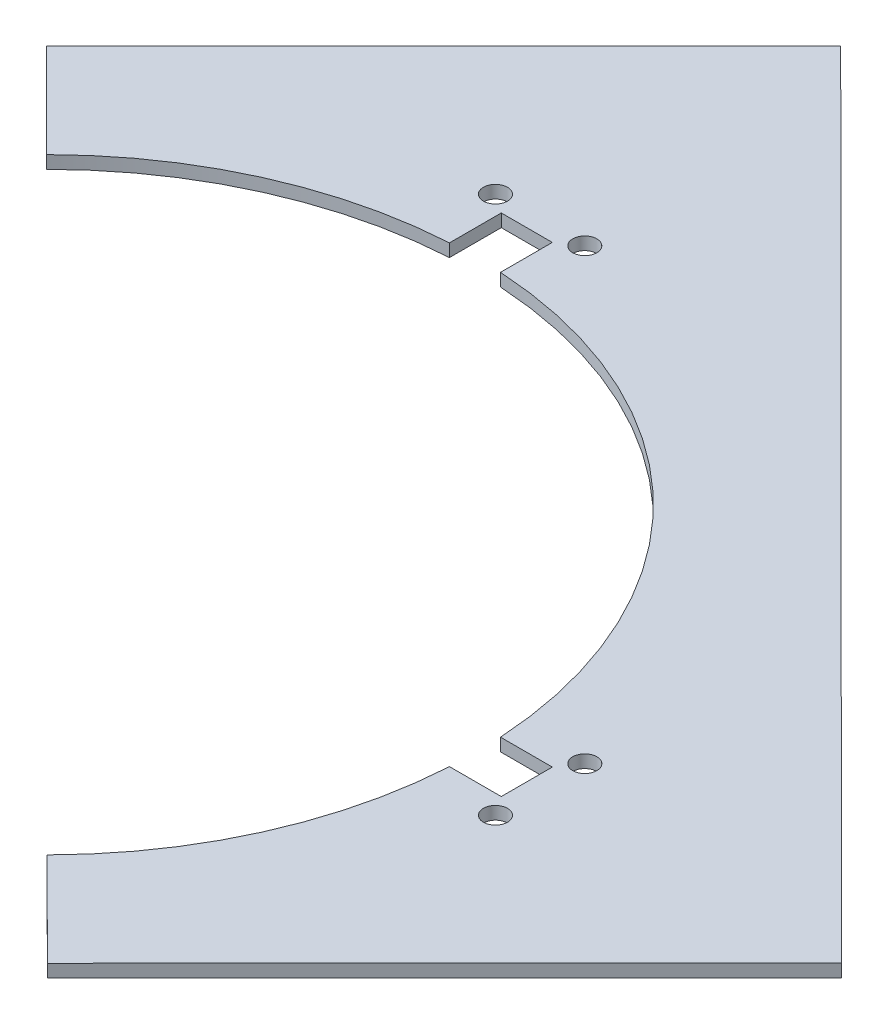
ISO-10303-21;
HEADER;
FILE_DESCRIPTION(('STEP AP214'),'2;1');
FILE_NAME('part.step','',(''),(''),'','','');
FILE_SCHEMA(('AUTOMOTIVE_DESIGN { 1 0 10303 214 1 1 1 1 }'));
ENDSEC;
DATA;
#1=APPLICATION_CONTEXT('core data for automotive mechanical design processes');
#2=APPLICATION_PROTOCOL_DEFINITION('international standard','automotive_design',2000,#1);
#3=PRODUCT_CONTEXT('',#1,'mechanical');
#4=PRODUCT('Part','Part','',(#3));
#5=PRODUCT_RELATED_PRODUCT_CATEGORY('part','',(#4));
#6=PRODUCT_DEFINITION_FORMATION('','',#4);
#7=PRODUCT_DEFINITION_CONTEXT('part definition',#1,'design');
#8=PRODUCT_DEFINITION('design','',#6,#7);
#9=PRODUCT_DEFINITION_SHAPE('','',#8);
#10=(LENGTH_UNIT() NAMED_UNIT(*) SI_UNIT(.MILLI.,.METRE.));
#11=(NAMED_UNIT(*) PLANE_ANGLE_UNIT() SI_UNIT($,.RADIAN.));
#12=(NAMED_UNIT(*) SI_UNIT($,.STERADIAN.) SOLID_ANGLE_UNIT());
#13=UNCERTAINTY_MEASURE_WITH_UNIT(LENGTH_MEASURE(1.E-05),#10,'distance_accuracy_value','');
#14=(GEOMETRIC_REPRESENTATION_CONTEXT(3) GLOBAL_UNCERTAINTY_ASSIGNED_CONTEXT((#13)) GLOBAL_UNIT_ASSIGNED_CONTEXT((#10,
#11,#12)) REPRESENTATION_CONTEXT('',''));
#15=CARTESIAN_POINT('',(0.,0.,0.));
#16=DIRECTION('',(0.,0.,1.));
#17=DIRECTION('',(1.,0.,0.));
#18=AXIS2_PLACEMENT_3D('',#15,#16,#17);
#19=CARTESIAN_POINT('',(0.,1.5875,0.));
#20=DIRECTION('',(0.,-1.,0.));
#21=DIRECTION('',(0.,0.,-1.));
#22=AXIS2_PLACEMENT_3D('',#19,#20,#21);
#23=CYLINDRICAL_SURFACE('',#22,53.34);
#24=DIRECTION('',(0.,-1.,0.));
#25=VECTOR('',#24,1.);
#26=CARTESIAN_POINT('',(-37.7350188158888,1.5875,-37.6991240609715));
#27=LINE('',#26,#25);
#28=CARTESIAN_POINT('',(-37.7350188158888,0.,-37.6991240609715));
#29=VERTEX_POINT('',#28);
#30=CARTESIAN_POINT('',(-37.7350188158888,1.5875,-37.6991240609715));
#31=VERTEX_POINT('',#30);
#32=EDGE_CURVE('E459',#29,#31,#27,.F.);
#33=ORIENTED_EDGE('',*,*,#32,.F.);
#34=CARTESIAN_POINT('',(0.,0.,0.));
#35=DIRECTION('',(0.,1.,0.));
#36=DIRECTION('',(0.,0.,1.));
#37=AXIS2_PLACEMENT_3D('',#34,#35,#36);
#38=CIRCLE('',#37,53.34);
#39=CARTESIAN_POINT('',(-3.175,0.,-53.2454221036889));
#40=VERTEX_POINT('',#39);
#41=EDGE_CURVE('E170',#40,#29,#38,.T.);
#42=ORIENTED_EDGE('',*,*,#41,.F.);
#43=DIRECTION('',(0.,-1.,0.));
#44=VECTOR('',#43,1.);
#45=CARTESIAN_POINT('',(-3.175,1.5875,-53.2454221036889));
#46=LINE('',#45,#44);
#47=CARTESIAN_POINT('',(-3.175,1.5875,-53.2454221036889));
#48=VERTEX_POINT('',#47);
#49=EDGE_CURVE('E153',#48,#40,#46,.T.);
#50=ORIENTED_EDGE('',*,*,#49,.F.);
#51=CARTESIAN_POINT('',(0.,1.5875,0.));
#52=DIRECTION('',(0.,1.,0.));
#53=DIRECTION('',(0.,0.,1.));
#54=AXIS2_PLACEMENT_3D('',#51,#52,#53);
#55=CIRCLE('',#54,53.34);
#56=EDGE_CURVE('E224',#48,#31,#55,.T.);
#57=ORIENTED_EDGE('',*,*,#56,.T.);
#58=EDGE_LOOP('',(#33,#42,#50,#57));
#59=FACE_BOUND('',#58,.T.);
#60=ADVANCED_FACE('F33',(#59),#23,.F.);
#61=DIRECTION('',(0.,-1.,0.));
#62=VECTOR('',#61,1.);
#63=CARTESIAN_POINT('',(3.175,1.5875,-53.2454221036889));
#64=LINE('',#63,#62);
#65=CARTESIAN_POINT('',(3.175,0.,-53.2454221036889));
#66=VERTEX_POINT('',#65);
#67=CARTESIAN_POINT('',(3.175,1.5875,-53.2454221036889));
#68=VERTEX_POINT('',#67);
#69=EDGE_CURVE('E157',#66,#68,#64,.F.);
#70=ORIENTED_EDGE('',*,*,#69,.F.);
#71=CARTESIAN_POINT('',(53.2454221036889,0.,-3.17499999999981));
#72=VERTEX_POINT('',#71);
#73=EDGE_CURVE('E174',#72,#66,#38,.T.);
#74=ORIENTED_EDGE('',*,*,#73,.F.);
#75=DIRECTION('',(0.,-1.,0.));
#76=VECTOR('',#75,1.);
#77=CARTESIAN_POINT('',(53.2454221036889,1.5875,-3.17499999999981));
#78=LINE('',#77,#76);
#79=CARTESIAN_POINT('',(53.2454221036889,1.5875,-3.17499999999981));
#80=VERTEX_POINT('',#79);
#81=EDGE_CURVE('E202',#80,#72,#78,.T.);
#82=ORIENTED_EDGE('',*,*,#81,.F.);
#83=EDGE_CURVE('E226',#80,#68,#55,.T.);
#84=ORIENTED_EDGE('',*,*,#83,.T.);
#85=EDGE_LOOP('',(#70,#74,#82,#84));
#86=FACE_BOUND('',#85,.T.);
#87=ADVANCED_FACE('F254',(#86),#23,.F.);
#88=DIRECTION('',(0.,-1.,0.));
#89=VECTOR('',#88,1.);
#90=CARTESIAN_POINT('',(37.7350188158888,1.5875,37.6991240609715));
#91=LINE('',#90,#89);
#92=CARTESIAN_POINT('',(37.7350188158888,1.5875,37.6991240609715));
#93=VERTEX_POINT('',#92);
#94=CARTESIAN_POINT('',(37.7350188158888,0.,37.6991240609715));
#95=VERTEX_POINT('',#94);
#96=EDGE_CURVE('E48',#93,#95,#91,.T.);
#97=ORIENTED_EDGE('',*,*,#96,.F.);
#98=CARTESIAN_POINT('',(53.2454221036889,1.5875,3.17500000000019));
#99=VERTEX_POINT('',#98);
#100=EDGE_CURVE('E201',#93,#99,#55,.T.);
#101=ORIENTED_EDGE('',*,*,#100,.T.);
#102=DIRECTION('',(0.,-1.,0.));
#103=VECTOR('',#102,1.);
#104=CARTESIAN_POINT('',(53.2454221036889,1.5875,3.17500000000019));
#105=LINE('',#104,#103);
#106=CARTESIAN_POINT('',(53.2454221036889,0.,3.17500000000019));
#107=VERTEX_POINT('',#106);
#108=EDGE_CURVE('E194',#107,#99,#105,.F.);
#109=ORIENTED_EDGE('',*,*,#108,.F.);
#110=EDGE_CURVE('E171',#95,#107,#38,.T.);
#111=ORIENTED_EDGE('',*,*,#110,.F.);
#112=EDGE_LOOP('',(#97,#101,#109,#111));
#113=FACE_BOUND('',#112,.T.);
#114=ADVANCED_FACE('F199',(#113),#23,.F.);
#115=CARTESIAN_POINT('',(49.4149055922353,1.5875,49.3679005560341));
#116=DIRECTION('',(-0.707443172401365,0.,-0.706770229864482));
#117=DIRECTION('',(-0.706770229864482,0.,0.707443172401365));
#118=AXIS2_PLACEMENT_3D('',#115,#116,#117);
#119=PLANE('',#118);
#120=DIRECTION('',(0.706770229864482,0.,-0.707443172401365));
#121=VECTOR('',#120,1.);
#122=CARTESIAN_POINT('',(49.4149055922353,1.5875,49.3679005560341));
#123=LINE('',#122,#121);
#124=CARTESIAN_POINT('',(49.4149055922354,1.5875,49.3679005560341));
#125=VERTEX_POINT('',#124);
#126=CARTESIAN_POINT('',(98.7828061482694,1.5875,-0.0470050362012392));
#127=VERTEX_POINT('',#126);
#128=EDGE_CURVE('E146',#125,#127,#123,.T.);
#129=ORIENTED_EDGE('',*,*,#128,.F.);
#130=DIRECTION('',(0.,1.,0.));
#131=VECTOR('',#130,1.);
#132=CARTESIAN_POINT('',(49.4149055922354,0.,49.3679005560341));
#133=LINE('',#132,#131);
#134=CARTESIAN_POINT('',(49.4149055922354,0.,49.3679005560341));
#135=VERTEX_POINT('',#134);
#136=EDGE_CURVE('E134',#135,#125,#133,.T.);
#137=ORIENTED_EDGE('',*,*,#136,.F.);
#138=DIRECTION('',(0.706770229864482,0.,-0.707443172401365));
#139=VECTOR('',#138,1.);
#140=CARTESIAN_POINT('',(49.4149055922353,0.,49.3679005560341));
#141=LINE('',#140,#139);
#142=CARTESIAN_POINT('',(98.7828061482694,0.,-0.0470050362012392));
#143=VERTEX_POINT('',#142);
#144=EDGE_CURVE('E144',#135,#143,#141,.T.);
#145=ORIENTED_EDGE('',*,*,#144,.T.);
#146=DIRECTION('',(0.,-1.,0.));
#147=VECTOR('',#146,1.);
#148=CARTESIAN_POINT('',(98.7828061482694,1.5875,-0.0470050362012392));
#149=LINE('',#148,#147);
#150=EDGE_CURVE('E183',#127,#143,#149,.T.);
#151=ORIENTED_EDGE('',*,*,#150,.F.);
#152=EDGE_LOOP('',(#129,#137,#145,#151));
#153=FACE_BOUND('',#152,.T.);
#154=ADVANCED_FACE('F35',(#153),#119,.F.);
#155=CARTESIAN_POINT('',(49.3679005560341,1.5875,-49.4149055922353));
#156=DIRECTION('',(-0.706770229864482,0.,0.707443172401365));
#157=DIRECTION('',(0.707443172401365,0.,0.706770229864482));
#158=AXIS2_PLACEMENT_3D('',#155,#156,#157);
#159=PLANE('',#158);
#160=DIRECTION('',(-0.707443172401365,0.,-0.706770229864482));
#161=VECTOR('',#160,1.);
#162=CARTESIAN_POINT('',(49.3679005560341,0.,-49.4149055922353));
#163=LINE('',#162,#161);
#164=CARTESIAN_POINT('',(-0.0470050362012461,0.,-98.7828061482694));
#165=VERTEX_POINT('',#164);
#166=EDGE_CURVE('E152',#143,#165,#163,.T.);
#167=ORIENTED_EDGE('',*,*,#166,.T.);
#168=DIRECTION('',(0.,-1.,0.));
#169=VECTOR('',#168,1.);
#170=CARTESIAN_POINT('',(-0.0470050362012461,1.5875,-98.7828061482694));
#171=LINE('',#170,#169);
#172=CARTESIAN_POINT('',(-0.0470050362012461,1.5875,-98.7828061482694));
#173=VERTEX_POINT('',#172);
#174=EDGE_CURVE('E180',#173,#165,#171,.T.);
#175=ORIENTED_EDGE('',*,*,#174,.F.);
#176=DIRECTION('',(-0.707443172401365,0.,-0.706770229864482));
#177=VECTOR('',#176,1.);
#178=CARTESIAN_POINT('',(49.3679005560341,1.5875,-49.4149055922353));
#179=LINE('',#178,#177);
#180=EDGE_CURVE('E213',#127,#173,#179,.T.);
#181=ORIENTED_EDGE('',*,*,#180,.F.);
#182=ORIENTED_EDGE('',*,*,#150,.T.);
#183=EDGE_LOOP('',(#167,#175,#181,#182));
#184=FACE_BOUND('',#183,.T.);
#185=ADVANCED_FACE('F269',(#184),#159,.F.);
#186=CARTESIAN_POINT('',(61.346730494,1.5875,5.55625));
#187=DIRECTION('',(0.,-1.,0.));
#188=DIRECTION('',(0.,0.,-1.));
#189=AXIS2_PLACEMENT_3D('',#186,#187,#188);
#190=CYLINDRICAL_SURFACE('',#189,1.5);
#191=CARTESIAN_POINT('',(61.346730494,1.5875,5.55625));
#192=DIRECTION('',(0.,1.,0.));
#193=DIRECTION('',(0.,0.,1.));
#194=AXIS2_PLACEMENT_3D('',#191,#192,#193);
#195=CIRCLE('',#194,1.5);
#196=CARTESIAN_POINT('',(61.346730494,1.5875,7.05625));
#197=VERTEX_POINT('',#196);
#198=EDGE_CURVE('E160',#197,#197,#195,.T.);
#199=ORIENTED_EDGE('',*,*,#198,.T.);
#200=EDGE_LOOP('',(#199));
#201=FACE_BOUND('',#200,.T.);
#202=CARTESIAN_POINT('',(61.346730494,0.,5.55625));
#203=DIRECTION('',(0.,1.,0.));
#204=DIRECTION('',(0.,0.,1.));
#205=AXIS2_PLACEMENT_3D('',#202,#203,#204);
#206=CIRCLE('',#205,1.5);
#207=CARTESIAN_POINT('',(61.346730494,0.,7.05625));
#208=VERTEX_POINT('',#207);
#209=EDGE_CURVE('E177',#208,#208,#206,.T.);
#210=ORIENTED_EDGE('',*,*,#209,.F.);
#211=EDGE_LOOP('',(#210));
#212=FACE_BOUND('',#211,.T.);
#213=ADVANCED_FACE('F233',(#201,#212),#190,.F.);
#214=CARTESIAN_POINT('',(61.346730494,1.5875,-5.55625));
#215=DIRECTION('',(0.,-1.,0.));
#216=DIRECTION('',(0.,0.,-1.));
#217=AXIS2_PLACEMENT_3D('',#214,#215,#216);
#218=CYLINDRICAL_SURFACE('',#217,1.5);
#219=CARTESIAN_POINT('',(61.346730494,1.5875,-5.55625));
#220=DIRECTION('',(0.,1.,0.));
#221=DIRECTION('',(0.,0.,1.));
#222=AXIS2_PLACEMENT_3D('',#219,#220,#221);
#223=CIRCLE('',#222,1.5);
#224=CARTESIAN_POINT('',(61.346730494,1.5875,-4.05625));
#225=VERTEX_POINT('',#224);
#226=EDGE_CURVE('E225',#225,#225,#223,.T.);
#227=ORIENTED_EDGE('',*,*,#226,.T.);
#228=EDGE_LOOP('',(#227));
#229=FACE_BOUND('',#228,.T.);
#230=CARTESIAN_POINT('',(61.346730494,0.,-5.55625));
#231=DIRECTION('',(0.,1.,0.));
#232=DIRECTION('',(0.,0.,1.));
#233=AXIS2_PLACEMENT_3D('',#230,#231,#232);
#234=CIRCLE('',#233,1.5);
#235=CARTESIAN_POINT('',(61.346730494,0.,-4.05625));
#236=VERTEX_POINT('',#235);
#237=EDGE_CURVE('E173',#236,#236,#234,.T.);
#238=ORIENTED_EDGE('',*,*,#237,.F.);
#239=EDGE_LOOP('',(#238));
#240=FACE_BOUND('',#239,.T.);
#241=ADVANCED_FACE('F277',(#229,#240),#218,.F.);
#242=CARTESIAN_POINT('',(5.55625,1.5875,-61.346730494));
#243=DIRECTION('',(0.,-1.,0.));
#244=DIRECTION('',(0.,0.,-1.));
#245=AXIS2_PLACEMENT_3D('',#242,#243,#244);
#246=CYLINDRICAL_SURFACE('',#245,1.5);
#247=CARTESIAN_POINT('',(5.55625,1.5875,-61.346730494));
#248=DIRECTION('',(0.,1.,0.));
#249=DIRECTION('',(0.,0.,1.));
#250=AXIS2_PLACEMENT_3D('',#247,#248,#249);
#251=CIRCLE('',#250,1.5);
#252=CARTESIAN_POINT('',(5.55625,1.5875,-59.846730494));
#253=VERTEX_POINT('',#252);
#254=EDGE_CURVE('E221',#253,#253,#251,.T.);
#255=ORIENTED_EDGE('',*,*,#254,.T.);
#256=EDGE_LOOP('',(#255));
#257=FACE_BOUND('',#256,.T.);
#258=CARTESIAN_POINT('',(5.55625,0.,-61.346730494));
#259=DIRECTION('',(0.,1.,0.));
#260=DIRECTION('',(0.,0.,1.));
#261=AXIS2_PLACEMENT_3D('',#258,#259,#260);
#262=CIRCLE('',#261,1.5);
#263=CARTESIAN_POINT('',(5.55625,0.,-59.846730494));
#264=VERTEX_POINT('',#263);
#265=EDGE_CURVE('E167',#264,#264,#262,.T.);
#266=ORIENTED_EDGE('',*,*,#265,.F.);
#267=EDGE_LOOP('',(#266));
#268=FACE_BOUND('',#267,.T.);
#269=ADVANCED_FACE('F281',(#257,#268),#246,.F.);
#270=CARTESIAN_POINT('',(-5.55625,1.5875,-61.346730494));
#271=DIRECTION('',(0.,-1.,0.));
#272=DIRECTION('',(0.,0.,-1.));
#273=AXIS2_PLACEMENT_3D('',#270,#271,#272);
#274=CYLINDRICAL_SURFACE('',#273,1.5);
#275=CARTESIAN_POINT('',(-5.55625,1.5875,-61.346730494));
#276=DIRECTION('',(0.,1.,0.));
#277=DIRECTION('',(0.,0.,1.));
#278=AXIS2_PLACEMENT_3D('',#275,#276,#277);
#279=CIRCLE('',#278,1.5);
#280=CARTESIAN_POINT('',(-5.55625,1.5875,-59.846730494));
#281=VERTEX_POINT('',#280);
#282=EDGE_CURVE('E218',#281,#281,#279,.T.);
#283=ORIENTED_EDGE('',*,*,#282,.T.);
#284=EDGE_LOOP('',(#283));
#285=FACE_BOUND('',#284,.T.);
#286=CARTESIAN_POINT('',(-5.55625,0.,-61.346730494));
#287=DIRECTION('',(0.,1.,0.));
#288=DIRECTION('',(0.,0.,1.));
#289=AXIS2_PLACEMENT_3D('',#286,#287,#288);
#290=CIRCLE('',#289,1.5);
#291=CARTESIAN_POINT('',(-5.55625,0.,-59.846730494));
#292=VERTEX_POINT('',#291);
#293=EDGE_CURVE('E164',#292,#292,#290,.T.);
#294=ORIENTED_EDGE('',*,*,#293,.F.);
#295=EDGE_LOOP('',(#294));
#296=FACE_BOUND('',#295,.T.);
#297=ADVANCED_FACE('F248',(#285,#296),#274,.F.);
#298=CARTESIAN_POINT('',(-49.4149055922353,1.5875,-49.3679005560341));
#299=DIRECTION('',(-0.707443172401365,0.,-0.706770229864482));
#300=DIRECTION('',(-0.706770229864482,0.,0.707443172401365));
#301=AXIS2_PLACEMENT_3D('',#298,#299,#300);
#302=PLANE('',#301);
#303=DIRECTION('',(0.,1.,0.));
#304=VECTOR('',#303,1.);
#305=CARTESIAN_POINT('',(-49.4149055922353,0.,-49.3679005560341));
#306=LINE('',#305,#304);
#307=CARTESIAN_POINT('',(-49.4149055922353,0.,-49.3679005560341));
#308=VERTEX_POINT('',#307);
#309=CARTESIAN_POINT('',(-49.4149055922353,1.5875,-49.3679005560341));
#310=VERTEX_POINT('',#309);
#311=EDGE_CURVE('E56',#308,#310,#306,.T.);
#312=ORIENTED_EDGE('',*,*,#311,.T.);
#313=DIRECTION('',(0.706770229864482,0.,-0.707443172401365));
#314=VECTOR('',#313,1.);
#315=CARTESIAN_POINT('',(-49.4149055922353,1.5875,-49.3679005560341));
#316=LINE('',#315,#314);
#317=EDGE_CURVE('E216',#310,#173,#316,.T.);
#318=ORIENTED_EDGE('',*,*,#317,.T.);
#319=ORIENTED_EDGE('',*,*,#174,.T.);
#320=DIRECTION('',(0.706770229864482,0.,-0.707443172401365));
#321=VECTOR('',#320,1.);
#322=CARTESIAN_POINT('',(-49.4149055922353,0.,-49.3679005560341));
#323=LINE('',#322,#321);
#324=EDGE_CURVE('E155',#308,#165,#323,.T.);
#325=ORIENTED_EDGE('',*,*,#324,.F.);
#326=EDGE_LOOP('',(#312,#318,#319,#325));
#327=FACE_BOUND('',#326,.T.);
#328=ADVANCED_FACE('F238',(#327),#302,.T.);
#329=CARTESIAN_POINT('',(0.,1.5875,0.));
#330=DIRECTION('',(0.,1.,0.));
#331=DIRECTION('',(0.,0.,1.));
#332=AXIS2_PLACEMENT_3D('',#329,#330,#331);
#333=PLANE('',#332);
#334=DIRECTION('',(-0.707443172401365,0.,-0.706770229864482));
#335=VECTOR('',#334,1.);
#336=CARTESIAN_POINT('',(-49.4149055922353,1.5875,-49.3679005560341));
#337=LINE('',#336,#335);
#338=EDGE_CURVE('E470',#125,#93,#337,.T.);
#339=ORIENTED_EDGE('',*,*,#338,.F.);
#340=ORIENTED_EDGE('',*,*,#128,.T.);
#341=ORIENTED_EDGE('',*,*,#180,.T.);
#342=ORIENTED_EDGE('',*,*,#317,.F.);
#343=EDGE_CURVE('E461',#31,#310,#337,.T.);
#344=ORIENTED_EDGE('',*,*,#343,.F.);
#345=ORIENTED_EDGE('',*,*,#56,.F.);
#346=DIRECTION('',(0.,0.,1.));
#347=VECTOR('',#346,1.);
#348=CARTESIAN_POINT('',(-3.175,1.5875,-53.34));
#349=LINE('',#348,#347);
#350=CARTESIAN_POINT('',(-3.175,1.5875,-59.69));
#351=VERTEX_POINT('',#350);
#352=EDGE_CURVE('E491',#351,#48,#349,.T.);
#353=ORIENTED_EDGE('',*,*,#352,.F.);
#354=DIRECTION('',(-1.,0.,0.));
#355=VECTOR('',#354,1.);
#356=CARTESIAN_POINT('',(3.175,1.5875,-59.69));
#357=LINE('',#356,#355);
#358=CARTESIAN_POINT('',(3.175,1.5875,-59.69));
#359=VERTEX_POINT('',#358);
#360=EDGE_CURVE('E486',#359,#351,#357,.T.);
#361=ORIENTED_EDGE('',*,*,#360,.F.);
#362=DIRECTION('',(0.,0.,-1.));
#363=VECTOR('',#362,1.);
#364=CARTESIAN_POINT('',(3.175,1.5875,-53.34));
#365=LINE('',#364,#363);
#366=EDGE_CURVE('E484',#68,#359,#365,.T.);
#367=ORIENTED_EDGE('',*,*,#366,.F.);
#368=ORIENTED_EDGE('',*,*,#83,.F.);
#369=DIRECTION('',(-1.,0.,0.));
#370=VECTOR('',#369,1.);
#371=CARTESIAN_POINT('',(53.3400000000014,1.5875,-3.17499999999981));
#372=LINE('',#371,#370);
#373=CARTESIAN_POINT('',(59.6900000000014,1.5875,-3.17499999999981));
#374=VERTEX_POINT('',#373);
#375=EDGE_CURVE('E482',#374,#80,#372,.T.);
#376=ORIENTED_EDGE('',*,*,#375,.F.);
#377=DIRECTION('',(0.,0.,-1.));
#378=VECTOR('',#377,1.);
#379=CARTESIAN_POINT('',(59.6900000000014,1.5875,3.17500000000019));
#380=LINE('',#379,#378);
#381=CARTESIAN_POINT('',(59.6900000000014,1.5875,3.17500000000019));
#382=VERTEX_POINT('',#381);
#383=EDGE_CURVE('E504',#382,#374,#380,.T.);
#384=ORIENTED_EDGE('',*,*,#383,.F.);
#385=DIRECTION('',(1.,0.,0.));
#386=VECTOR('',#385,1.);
#387=CARTESIAN_POINT('',(53.3400000000014,1.5875,3.17500000000019));
#388=LINE('',#387,#386);
#389=EDGE_CURVE('E465',#99,#382,#388,.T.);
#390=ORIENTED_EDGE('',*,*,#389,.F.);
#391=ORIENTED_EDGE('',*,*,#100,.F.);
#392=EDGE_LOOP('',(#339,#340,#341,#342,#344,#345,#353,#361,#367,#368,#376,#384,#390,#391));
#393=FACE_BOUND('',#392,.T.);
#394=ORIENTED_EDGE('',*,*,#282,.F.);
#395=EDGE_LOOP('',(#394));
#396=FACE_BOUND('',#395,.T.);
#397=ORIENTED_EDGE('',*,*,#254,.F.);
#398=EDGE_LOOP('',(#397));
#399=FACE_BOUND('',#398,.T.);
#400=ORIENTED_EDGE('',*,*,#226,.F.);
#401=EDGE_LOOP('',(#400));
#402=FACE_BOUND('',#401,.T.);
#403=ORIENTED_EDGE('',*,*,#198,.F.);
#404=EDGE_LOOP('',(#403));
#405=FACE_BOUND('',#404,.T.);
#406=ADVANCED_FACE('F236',(#393,#396,#399,#402,#405),#333,.T.);
#407=CARTESIAN_POINT('',(0.,0.,0.));
#408=DIRECTION('',(0.,1.,0.));
#409=DIRECTION('',(0.,0.,1.));
#410=AXIS2_PLACEMENT_3D('',#407,#408,#409);
#411=PLANE('',#410);
#412=ORIENTED_EDGE('',*,*,#293,.T.);
#413=EDGE_LOOP('',(#412));
#414=FACE_BOUND('',#413,.T.);
#415=ORIENTED_EDGE('',*,*,#265,.T.);
#416=EDGE_LOOP('',(#415));
#417=FACE_BOUND('',#416,.T.);
#418=ORIENTED_EDGE('',*,*,#144,.F.);
#419=DIRECTION('',(-0.707443172401365,0.,-0.706770229864482));
#420=VECTOR('',#419,1.);
#421=CARTESIAN_POINT('',(-49.4149055922353,0.,-49.3679005560341));
#422=LINE('',#421,#420);
#423=EDGE_CURVE('E131',#135,#95,#422,.T.);
#424=ORIENTED_EDGE('',*,*,#423,.T.);
#425=ORIENTED_EDGE('',*,*,#110,.T.);
#426=DIRECTION('',(1.,0.,0.));
#427=VECTOR('',#426,1.);
#428=CARTESIAN_POINT('',(0.,0.,3.17500000000019));
#429=LINE('',#428,#427);
#430=CARTESIAN_POINT('',(59.6900000000014,0.,3.17500000000019));
#431=VERTEX_POINT('',#430);
#432=EDGE_CURVE('E41',#107,#431,#429,.T.);
#433=ORIENTED_EDGE('',*,*,#432,.T.);
#434=DIRECTION('',(0.,0.,-1.));
#435=VECTOR('',#434,1.);
#436=CARTESIAN_POINT('',(59.6900000000014,0.,3.17500000000019));
#437=LINE('',#436,#435);
#438=CARTESIAN_POINT('',(59.6900000000014,0.,-3.17499999999981));
#439=VERTEX_POINT('',#438);
#440=EDGE_CURVE('E188',#431,#439,#437,.T.);
#441=ORIENTED_EDGE('',*,*,#440,.T.);
#442=DIRECTION('',(-1.,0.,0.));
#443=VECTOR('',#442,1.);
#444=CARTESIAN_POINT('',(59.6900000000014,0.,-3.17499999999981));
#445=LINE('',#444,#443);
#446=EDGE_CURVE('E501',#439,#72,#445,.T.);
#447=ORIENTED_EDGE('',*,*,#446,.T.);
#448=ORIENTED_EDGE('',*,*,#73,.T.);
#449=DIRECTION('',(0.,0.,-1.));
#450=VECTOR('',#449,1.);
#451=CARTESIAN_POINT('',(3.175,0.,0.));
#452=LINE('',#451,#450);
#453=CARTESIAN_POINT('',(3.175,0.,-59.69));
#454=VERTEX_POINT('',#453);
#455=EDGE_CURVE('E11',#66,#454,#452,.T.);
#456=ORIENTED_EDGE('',*,*,#455,.T.);
#457=DIRECTION('',(-1.,0.,0.));
#458=VECTOR('',#457,1.);
#459=CARTESIAN_POINT('',(3.175,0.,-59.69));
#460=LINE('',#459,#458);
#461=CARTESIAN_POINT('',(-3.175,0.,-59.69));
#462=VERTEX_POINT('',#461);
#463=EDGE_CURVE('E497',#454,#462,#460,.T.);
#464=ORIENTED_EDGE('',*,*,#463,.T.);
#465=DIRECTION('',(0.,0.,1.));
#466=VECTOR('',#465,1.);
#467=CARTESIAN_POINT('',(-3.175,0.,-59.69));
#468=LINE('',#467,#466);
#469=EDGE_CURVE('E494',#462,#40,#468,.T.);
#470=ORIENTED_EDGE('',*,*,#469,.T.);
#471=ORIENTED_EDGE('',*,*,#41,.T.);
#472=EDGE_CURVE('E139',#29,#308,#422,.T.);
#473=ORIENTED_EDGE('',*,*,#472,.T.);
#474=ORIENTED_EDGE('',*,*,#324,.T.);
#475=ORIENTED_EDGE('',*,*,#166,.F.);
#476=EDGE_LOOP('',(#418,#424,#425,#433,#441,#447,#448,#456,#464,#470,#471,#473,#474,#475));
#477=FACE_BOUND('',#476,.T.);
#478=ORIENTED_EDGE('',*,*,#237,.T.);
#479=EDGE_LOOP('',(#478));
#480=FACE_BOUND('',#479,.T.);
#481=ORIENTED_EDGE('',*,*,#209,.T.);
#482=EDGE_LOOP('',(#481));
#483=FACE_BOUND('',#482,.T.);
#484=ADVANCED_FACE('F149',(#414,#417,#477,#480,#483),#411,.F.);
#485=CARTESIAN_POINT('',(53.3400000000014,0.,-3.17499999999981));
#486=DIRECTION('',(0.,0.,-1.));
#487=DIRECTION('',(-1.,0.,0.));
#488=AXIS2_PLACEMENT_3D('',#485,#486,#487);
#489=PLANE('',#488);
#490=ORIENTED_EDGE('',*,*,#81,.T.);
#491=ORIENTED_EDGE('',*,*,#446,.F.);
#492=DIRECTION('',(0.,1.,0.));
#493=VECTOR('',#492,1.);
#494=CARTESIAN_POINT('',(59.6900000000014,0.,-3.17499999999981));
#495=LINE('',#494,#493);
#496=EDGE_CURVE('E489',#439,#374,#495,.T.);
#497=ORIENTED_EDGE('',*,*,#496,.T.);
#498=ORIENTED_EDGE('',*,*,#375,.T.);
#499=EDGE_LOOP('',(#490,#491,#497,#498));
#500=FACE_BOUND('',#499,.T.);
#501=ADVANCED_FACE('F245',(#500),#489,.F.);
#502=CARTESIAN_POINT('',(59.6900000000014,0.,3.17500000000019));
#503=DIRECTION('',(1.,0.,0.));
#504=DIRECTION('',(0.,0.,-1.));
#505=AXIS2_PLACEMENT_3D('',#502,#503,#504);
#506=PLANE('',#505);
#507=ORIENTED_EDGE('',*,*,#383,.T.);
#508=ORIENTED_EDGE('',*,*,#496,.F.);
#509=ORIENTED_EDGE('',*,*,#440,.F.);
#510=DIRECTION('',(0.,1.,0.));
#511=VECTOR('',#510,1.);
#512=CARTESIAN_POINT('',(59.6900000000014,0.,3.17500000000019));
#513=LINE('',#512,#511);
#514=EDGE_CURVE('E197',#431,#382,#513,.T.);
#515=ORIENTED_EDGE('',*,*,#514,.T.);
#516=EDGE_LOOP('',(#507,#508,#509,#515));
#517=FACE_BOUND('',#516,.T.);
#518=ADVANCED_FACE('F338',(#517),#506,.F.);
#519=CARTESIAN_POINT('',(53.3400000000014,0.,3.17500000000019));
#520=DIRECTION('',(0.,0.,1.));
#521=DIRECTION('',(1.,0.,0.));
#522=AXIS2_PLACEMENT_3D('',#519,#520,#521);
#523=PLANE('',#522);
#524=ORIENTED_EDGE('',*,*,#108,.T.);
#525=ORIENTED_EDGE('',*,*,#389,.T.);
#526=ORIENTED_EDGE('',*,*,#514,.F.);
#527=ORIENTED_EDGE('',*,*,#432,.F.);
#528=EDGE_LOOP('',(#524,#525,#526,#527));
#529=FACE_BOUND('',#528,.T.);
#530=ADVANCED_FACE('F193',(#529),#523,.F.);
#531=CARTESIAN_POINT('',(-3.175,0.,-53.34));
#532=DIRECTION('',(-1.,0.,0.));
#533=DIRECTION('',(0.,0.,1.));
#534=AXIS2_PLACEMENT_3D('',#531,#532,#533);
#535=PLANE('',#534);
#536=ORIENTED_EDGE('',*,*,#49,.T.);
#537=ORIENTED_EDGE('',*,*,#469,.F.);
#538=DIRECTION('',(0.,1.,0.));
#539=VECTOR('',#538,1.);
#540=CARTESIAN_POINT('',(-3.175,0.,-59.69));
#541=LINE('',#540,#539);
#542=EDGE_CURVE('E203',#462,#351,#541,.T.);
#543=ORIENTED_EDGE('',*,*,#542,.T.);
#544=ORIENTED_EDGE('',*,*,#352,.T.);
#545=EDGE_LOOP('',(#536,#537,#543,#544));
#546=FACE_BOUND('',#545,.T.);
#547=ADVANCED_FACE('F358',(#546),#535,.F.);
#548=CARTESIAN_POINT('',(3.175,0.,-59.69));
#549=DIRECTION('',(0.,0.,-1.));
#550=DIRECTION('',(-1.,0.,0.));
#551=AXIS2_PLACEMENT_3D('',#548,#549,#550);
#552=PLANE('',#551);
#553=ORIENTED_EDGE('',*,*,#360,.T.);
#554=ORIENTED_EDGE('',*,*,#542,.F.);
#555=ORIENTED_EDGE('',*,*,#463,.F.);
#556=DIRECTION('',(0.,1.,0.));
#557=VECTOR('',#556,1.);
#558=CARTESIAN_POINT('',(3.175,0.,-59.69));
#559=LINE('',#558,#557);
#560=EDGE_CURVE('E206',#454,#359,#559,.T.);
#561=ORIENTED_EDGE('',*,*,#560,.T.);
#562=EDGE_LOOP('',(#553,#554,#555,#561));
#563=FACE_BOUND('',#562,.T.);
#564=ADVANCED_FACE('F368',(#563),#552,.F.);
#565=CARTESIAN_POINT('',(3.175,0.,-53.34));
#566=DIRECTION('',(1.,0.,0.));
#567=DIRECTION('',(0.,0.,-1.));
#568=AXIS2_PLACEMENT_3D('',#565,#566,#567);
#569=PLANE('',#568);
#570=ORIENTED_EDGE('',*,*,#69,.T.);
#571=ORIENTED_EDGE('',*,*,#366,.T.);
#572=ORIENTED_EDGE('',*,*,#560,.F.);
#573=ORIENTED_EDGE('',*,*,#455,.F.);
#574=EDGE_LOOP('',(#570,#571,#572,#573));
#575=FACE_BOUND('',#574,.T.);
#576=ADVANCED_FACE('F380',(#575),#569,.F.);
#577=CARTESIAN_POINT('',(-49.4149055922353,0.,-49.3679005560341));
#578=DIRECTION('',(0.706770229864482,0.,-0.707443172401365));
#579=DIRECTION('',(-0.707443172401365,0.,-0.706770229864482));
#580=AXIS2_PLACEMENT_3D('',#577,#578,#579);
#581=PLANE('',#580);
#582=ORIENTED_EDGE('',*,*,#32,.T.);
#583=ORIENTED_EDGE('',*,*,#343,.T.);
#584=ORIENTED_EDGE('',*,*,#311,.F.);
#585=ORIENTED_EDGE('',*,*,#472,.F.);
#586=EDGE_LOOP('',(#582,#583,#584,#585));
#587=FACE_BOUND('',#586,.T.);
#588=ADVANCED_FACE('F388',(#587),#581,.F.);
#589=ORIENTED_EDGE('',*,*,#96,.T.);
#590=ORIENTED_EDGE('',*,*,#423,.F.);
#591=ORIENTED_EDGE('',*,*,#136,.T.);
#592=ORIENTED_EDGE('',*,*,#338,.T.);
#593=EDGE_LOOP('',(#589,#590,#591,#592));
#594=FACE_BOUND('',#593,.T.);
#595=ADVANCED_FACE('F133',(#594),#581,.F.);
#596=CLOSED_SHELL('',(#60,#87,#114,#154,#185,#213,#241,#269,#297,#328,#406,#484,#501,#518,#530,
#547,#564,#576,#588,#595));
#597=MANIFOLD_SOLID_BREP('B2',#596);
#598=ADVANCED_BREP_SHAPE_REPRESENTATION('',(#18,#597),#14);
#599=SHAPE_DEFINITION_REPRESENTATION(#9,#598);
ENDSEC;
END-ISO-10303-21;
